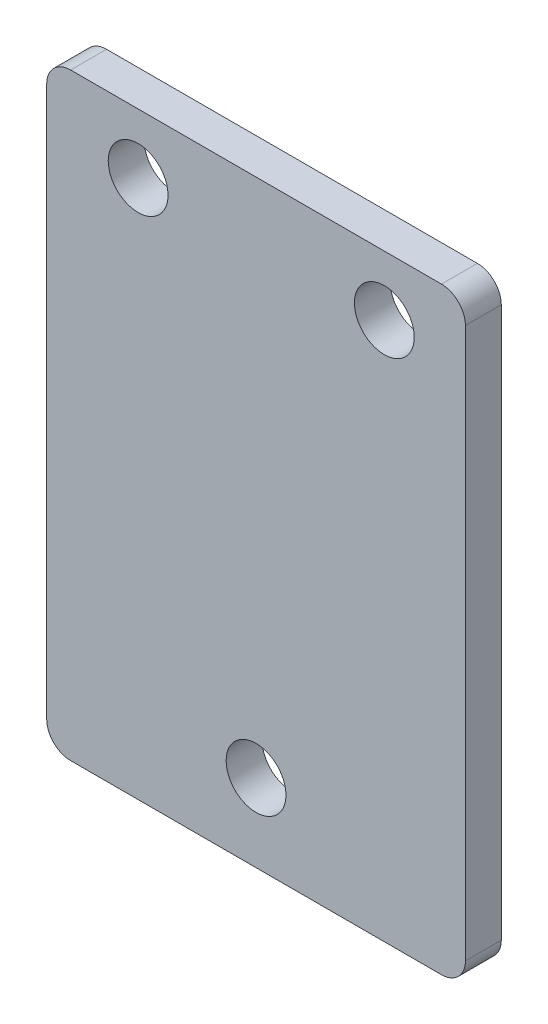
ISO-10303-21;
HEADER;
FILE_DESCRIPTION(('STEP AP214'),'2;1');
FILE_NAME('part.step','',(''),(''),'','','');
FILE_SCHEMA(('AUTOMOTIVE_DESIGN { 1 0 10303 214 1 1 1 1 }'));
ENDSEC;
DATA;
#1=APPLICATION_CONTEXT('core data for automotive mechanical design processes');
#2=APPLICATION_PROTOCOL_DEFINITION('international standard','automotive_design',2000,#1);
#3=PRODUCT_CONTEXT('',#1,'mechanical');
#4=PRODUCT('Part','Part','',(#3));
#5=PRODUCT_RELATED_PRODUCT_CATEGORY('part','',(#4));
#6=PRODUCT_DEFINITION_FORMATION('','',#4);
#7=PRODUCT_DEFINITION_CONTEXT('part definition',#1,'design');
#8=PRODUCT_DEFINITION('design','',#6,#7);
#9=PRODUCT_DEFINITION_SHAPE('','',#8);
#10=(LENGTH_UNIT() NAMED_UNIT(*) SI_UNIT(.MILLI.,.METRE.));
#11=(NAMED_UNIT(*) PLANE_ANGLE_UNIT() SI_UNIT($,.RADIAN.));
#12=(NAMED_UNIT(*) SI_UNIT($,.STERADIAN.) SOLID_ANGLE_UNIT());
#13=UNCERTAINTY_MEASURE_WITH_UNIT(LENGTH_MEASURE(1.E-05),#10,'distance_accuracy_value','');
#14=(GEOMETRIC_REPRESENTATION_CONTEXT(3) GLOBAL_UNCERTAINTY_ASSIGNED_CONTEXT((#13)) GLOBAL_UNIT_ASSIGNED_CONTEXT((#10,
#11,#12)) REPRESENTATION_CONTEXT('',''));
#15=CARTESIAN_POINT('',(0.,0.,0.));
#16=DIRECTION('',(0.,0.,1.));
#17=DIRECTION('',(1.,0.,0.));
#18=AXIS2_PLACEMENT_3D('',#15,#16,#17);
#19=CARTESIAN_POINT('',(15.5,-33.,-3.));
#20=DIRECTION('',(0.,0.,-1.));
#21=DIRECTION('',(-1.,0.,0.));
#22=AXIS2_PLACEMENT_3D('',#19,#20,#21);
#23=PLANE('',#22);
#24=CARTESIAN_POINT('',(-9.85884103233329,10.,-3.));
#25=DIRECTION('',(0.,0.,-1.));
#26=DIRECTION('',(-1.,0.,0.));
#27=AXIS2_PLACEMENT_3D('',#24,#25,#26);
#28=CIRCLE('',#27,2.5);
#29=CARTESIAN_POINT('',(-12.3588410323333,10.,-3.));
#30=VERTEX_POINT('',#29);
#31=EDGE_CURVE('E182',#30,#30,#28,.T.);
#32=ORIENTED_EDGE('',*,*,#31,.F.);
#33=EDGE_LOOP('',(#32));
#34=FACE_BOUND('',#33,.T.);
#35=CARTESIAN_POINT('',(15.5,-33.,-3.));
#36=DIRECTION('',(0.,0.,-1.));
#37=DIRECTION('',(-1.,0.,0.));
#38=AXIS2_PLACEMENT_3D('',#35,#36,#37);
#39=CIRCLE('',#38,2.);
#40=CARTESIAN_POINT('',(17.5,-33.,-3.));
#41=VERTEX_POINT('',#40);
#42=CARTESIAN_POINT('',(15.5,-35.,-3.));
#43=VERTEX_POINT('',#42);
#44=EDGE_CURVE('E145',#41,#43,#39,.T.);
#45=ORIENTED_EDGE('',*,*,#44,.T.);
#46=DIRECTION('',(-1.,0.,0.));
#47=VECTOR('',#46,1.);
#48=CARTESIAN_POINT('',(-15.5,-35.,-3.));
#49=LINE('',#48,#47);
#50=CARTESIAN_POINT('',(-15.5,-35.,-3.));
#51=VERTEX_POINT('',#50);
#52=EDGE_CURVE('E93',#43,#51,#49,.T.);
#53=ORIENTED_EDGE('',*,*,#52,.T.);
#54=CARTESIAN_POINT('',(-15.5,-33.,-3.));
#55=DIRECTION('',(0.,0.,-1.));
#56=DIRECTION('',(1.,0.,0.));
#57=AXIS2_PLACEMENT_3D('',#54,#55,#56);
#58=CIRCLE('',#57,2.);
#59=CARTESIAN_POINT('',(-17.5,-33.,-3.));
#60=VERTEX_POINT('',#59);
#61=EDGE_CURVE('E160',#51,#60,#58,.T.);
#62=ORIENTED_EDGE('',*,*,#61,.T.);
#63=DIRECTION('',(0.,1.,0.));
#64=VECTOR('',#63,1.);
#65=CARTESIAN_POINT('',(-17.5,-33.,-3.));
#66=LINE('',#65,#64);
#67=CARTESIAN_POINT('',(-17.5,13.,-3.));
#68=VERTEX_POINT('',#67);
#69=EDGE_CURVE('E173',#60,#68,#66,.T.);
#70=ORIENTED_EDGE('',*,*,#69,.T.);
#71=CARTESIAN_POINT('',(-15.5,13.,-3.));
#72=DIRECTION('',(0.,0.,-1.));
#73=DIRECTION('',(1.,0.,0.));
#74=AXIS2_PLACEMENT_3D('',#71,#72,#73);
#75=CIRCLE('',#74,2.);
#76=CARTESIAN_POINT('',(-15.5,15.,-3.));
#77=VERTEX_POINT('',#76);
#78=EDGE_CURVE('E112',#68,#77,#75,.T.);
#79=ORIENTED_EDGE('',*,*,#78,.T.);
#80=DIRECTION('',(1.,0.,0.));
#81=VECTOR('',#80,1.);
#82=CARTESIAN_POINT('',(-15.5,15.,-3.));
#83=LINE('',#82,#81);
#84=CARTESIAN_POINT('',(15.5,15.,-3.));
#85=VERTEX_POINT('',#84);
#86=EDGE_CURVE('E106',#77,#85,#83,.T.);
#87=ORIENTED_EDGE('',*,*,#86,.T.);
#88=CARTESIAN_POINT('',(15.5,13.,-3.));
#89=DIRECTION('',(0.,0.,-1.));
#90=DIRECTION('',(-1.,0.,0.));
#91=AXIS2_PLACEMENT_3D('',#88,#89,#90);
#92=CIRCLE('',#91,2.);
#93=CARTESIAN_POINT('',(17.5,13.,-3.));
#94=VERTEX_POINT('',#93);
#95=EDGE_CURVE('E110',#85,#94,#92,.T.);
#96=ORIENTED_EDGE('',*,*,#95,.T.);
#97=DIRECTION('',(0.,-1.,0.));
#98=VECTOR('',#97,1.);
#99=CARTESIAN_POINT('',(17.5,-33.,-3.));
#100=LINE('',#99,#98);
#101=EDGE_CURVE('E50',#94,#41,#100,.T.);
#102=ORIENTED_EDGE('',*,*,#101,.T.);
#103=EDGE_LOOP('',(#45,#53,#62,#70,#79,#87,#96,#102));
#104=FACE_BOUND('',#103,.T.);
#105=CARTESIAN_POINT('',(0.,-28.5,-3.));
#106=DIRECTION('',(0.,0.,-1.));
#107=DIRECTION('',(-1.,0.,0.));
#108=AXIS2_PLACEMENT_3D('',#105,#106,#107);
#109=CIRCLE('',#108,2.5);
#110=CARTESIAN_POINT('',(-2.5,-28.5,-3.));
#111=VERTEX_POINT('',#110);
#112=EDGE_CURVE('E134',#111,#111,#109,.T.);
#113=ORIENTED_EDGE('',*,*,#112,.F.);
#114=EDGE_LOOP('',(#113));
#115=FACE_BOUND('',#114,.T.);
#116=CARTESIAN_POINT('',(10.7207553969765,10.,-3.));
#117=DIRECTION('',(0.,0.,-1.));
#118=DIRECTION('',(-1.,0.,0.));
#119=AXIS2_PLACEMENT_3D('',#116,#117,#118);
#120=CIRCLE('',#119,2.5);
#121=CARTESIAN_POINT('',(8.22075539697653,10.,-3.));
#122=VERTEX_POINT('',#121);
#123=EDGE_CURVE('E188',#122,#122,#120,.T.);
#124=ORIENTED_EDGE('',*,*,#123,.F.);
#125=EDGE_LOOP('',(#124));
#126=FACE_BOUND('',#125,.T.);
#127=ADVANCED_FACE('F33',(#34,#104,#115,#126),#23,.T.);
#128=CARTESIAN_POINT('',(15.5,-33.,0.));
#129=DIRECTION('',(0.,0.,-1.));
#130=DIRECTION('',(-1.,0.,0.));
#131=AXIS2_PLACEMENT_3D('',#128,#129,#130);
#132=PLANE('',#131);
#133=CARTESIAN_POINT('',(15.5,-33.,0.));
#134=DIRECTION('',(0.,0.,-1.));
#135=DIRECTION('',(-1.,0.,0.));
#136=AXIS2_PLACEMENT_3D('',#133,#134,#135);
#137=CIRCLE('',#136,2.);
#138=CARTESIAN_POINT('',(17.5,-33.,0.));
#139=VERTEX_POINT('',#138);
#140=CARTESIAN_POINT('',(15.5,-35.,0.));
#141=VERTEX_POINT('',#140);
#142=EDGE_CURVE('E130',#139,#141,#137,.T.);
#143=ORIENTED_EDGE('',*,*,#142,.F.);
#144=DIRECTION('',(0.,-1.,0.));
#145=VECTOR('',#144,1.);
#146=CARTESIAN_POINT('',(17.5,-33.,0.));
#147=LINE('',#146,#145);
#148=CARTESIAN_POINT('',(17.5,13.,0.));
#149=VERTEX_POINT('',#148);
#150=EDGE_CURVE('E85',#149,#139,#147,.T.);
#151=ORIENTED_EDGE('',*,*,#150,.F.);
#152=CARTESIAN_POINT('',(15.5,13.,0.));
#153=DIRECTION('',(0.,0.,-1.));
#154=DIRECTION('',(-1.,0.,0.));
#155=AXIS2_PLACEMENT_3D('',#152,#153,#154);
#156=CIRCLE('',#155,2.);
#157=CARTESIAN_POINT('',(15.5,15.,0.));
#158=VERTEX_POINT('',#157);
#159=EDGE_CURVE('E79',#158,#149,#156,.T.);
#160=ORIENTED_EDGE('',*,*,#159,.F.);
#161=DIRECTION('',(1.,0.,0.));
#162=VECTOR('',#161,1.);
#163=CARTESIAN_POINT('',(-15.5,15.,0.));
#164=LINE('',#163,#162);
#165=CARTESIAN_POINT('',(-15.5,15.,0.));
#166=VERTEX_POINT('',#165);
#167=EDGE_CURVE('E120',#166,#158,#164,.T.);
#168=ORIENTED_EDGE('',*,*,#167,.F.);
#169=CARTESIAN_POINT('',(-15.5,13.,0.));
#170=DIRECTION('',(0.,0.,-1.));
#171=DIRECTION('',(1.,0.,0.));
#172=AXIS2_PLACEMENT_3D('',#169,#170,#171);
#173=CIRCLE('',#172,2.);
#174=CARTESIAN_POINT('',(-17.5,13.,0.));
#175=VERTEX_POINT('',#174);
#176=EDGE_CURVE('E140',#175,#166,#173,.T.);
#177=ORIENTED_EDGE('',*,*,#176,.F.);
#178=DIRECTION('',(0.,1.,0.));
#179=VECTOR('',#178,1.);
#180=CARTESIAN_POINT('',(-17.5,-33.,0.));
#181=LINE('',#180,#179);
#182=CARTESIAN_POINT('',(-17.5,-33.,0.));
#183=VERTEX_POINT('',#182);
#184=EDGE_CURVE('E138',#183,#175,#181,.T.);
#185=ORIENTED_EDGE('',*,*,#184,.F.);
#186=CARTESIAN_POINT('',(-15.5,-33.,0.));
#187=DIRECTION('',(0.,0.,-1.));
#188=DIRECTION('',(1.,0.,0.));
#189=AXIS2_PLACEMENT_3D('',#186,#187,#188);
#190=CIRCLE('',#189,2.);
#191=CARTESIAN_POINT('',(-15.5,-35.,0.));
#192=VERTEX_POINT('',#191);
#193=EDGE_CURVE('E136',#192,#183,#190,.T.);
#194=ORIENTED_EDGE('',*,*,#193,.F.);
#195=DIRECTION('',(-1.,0.,0.));
#196=VECTOR('',#195,1.);
#197=CARTESIAN_POINT('',(-15.5,-35.,0.));
#198=LINE('',#197,#196);
#199=EDGE_CURVE('E133',#141,#192,#198,.T.);
#200=ORIENTED_EDGE('',*,*,#199,.F.);
#201=EDGE_LOOP('',(#143,#151,#160,#168,#177,#185,#194,#200));
#202=FACE_BOUND('',#201,.T.);
#203=CARTESIAN_POINT('',(0.,-28.5,0.));
#204=DIRECTION('',(0.,0.,-1.));
#205=DIRECTION('',(-1.,0.,0.));
#206=AXIS2_PLACEMENT_3D('',#203,#204,#205);
#207=CIRCLE('',#206,2.5);
#208=CARTESIAN_POINT('',(-2.5,-28.5,0.));
#209=VERTEX_POINT('',#208);
#210=EDGE_CURVE('E179',#209,#209,#207,.T.);
#211=ORIENTED_EDGE('',*,*,#210,.T.);
#212=EDGE_LOOP('',(#211));
#213=FACE_BOUND('',#212,.T.);
#214=CARTESIAN_POINT('',(-9.85884103233329,10.,0.));
#215=DIRECTION('',(0.,0.,-1.));
#216=DIRECTION('',(-1.,0.,0.));
#217=AXIS2_PLACEMENT_3D('',#214,#215,#216);
#218=CIRCLE('',#217,2.5);
#219=CARTESIAN_POINT('',(-12.3588410323333,10.,0.));
#220=VERTEX_POINT('',#219);
#221=EDGE_CURVE('E185',#220,#220,#218,.T.);
#222=ORIENTED_EDGE('',*,*,#221,.T.);
#223=EDGE_LOOP('',(#222));
#224=FACE_BOUND('',#223,.T.);
#225=CARTESIAN_POINT('',(10.7207553969765,10.,0.));
#226=DIRECTION('',(0.,0.,-1.));
#227=DIRECTION('',(-1.,0.,0.));
#228=AXIS2_PLACEMENT_3D('',#225,#226,#227);
#229=CIRCLE('',#228,2.5);
#230=CARTESIAN_POINT('',(8.22075539697653,10.,0.));
#231=VERTEX_POINT('',#230);
#232=EDGE_CURVE('E191',#231,#231,#229,.T.);
#233=ORIENTED_EDGE('',*,*,#232,.T.);
#234=EDGE_LOOP('',(#233));
#235=FACE_BOUND('',#234,.T.);
#236=ADVANCED_FACE('F164',(#202,#213,#224,#235),#132,.F.);
#237=CARTESIAN_POINT('',(15.5,-33.,-3.));
#238=DIRECTION('',(0.,0.,1.));
#239=DIRECTION('',(1.,0.,0.));
#240=AXIS2_PLACEMENT_3D('',#237,#238,#239);
#241=CYLINDRICAL_SURFACE('',#240,2.);
#242=ORIENTED_EDGE('',*,*,#142,.T.);
#243=DIRECTION('',(0.,0.,1.));
#244=VECTOR('',#243,1.);
#245=CARTESIAN_POINT('',(15.5,-35.,-3.));
#246=LINE('',#245,#244);
#247=EDGE_CURVE('E11',#43,#141,#246,.T.);
#248=ORIENTED_EDGE('',*,*,#247,.F.);
#249=ORIENTED_EDGE('',*,*,#44,.F.);
#250=DIRECTION('',(0.,0.,1.));
#251=VECTOR('',#250,1.);
#252=CARTESIAN_POINT('',(17.5,-33.,-3.));
#253=LINE('',#252,#251);
#254=EDGE_CURVE('E126',#41,#139,#253,.T.);
#255=ORIENTED_EDGE('',*,*,#254,.T.);
#256=EDGE_LOOP('',(#242,#248,#249,#255));
#257=FACE_BOUND('',#256,.T.);
#258=ADVANCED_FACE('F35',(#257),#241,.T.);
#259=CARTESIAN_POINT('',(-15.5,-35.,-3.));
#260=DIRECTION('',(0.,1.,0.));
#261=DIRECTION('',(-1.,0.,0.));
#262=AXIS2_PLACEMENT_3D('',#259,#260,#261);
#263=PLANE('',#262);
#264=ORIENTED_EDGE('',*,*,#199,.T.);
#265=DIRECTION('',(0.,0.,1.));
#266=VECTOR('',#265,1.);
#267=CARTESIAN_POINT('',(-15.5,-35.,-3.));
#268=LINE('',#267,#266);
#269=EDGE_CURVE('E42',#51,#192,#268,.T.);
#270=ORIENTED_EDGE('',*,*,#269,.F.);
#271=ORIENTED_EDGE('',*,*,#52,.F.);
#272=ORIENTED_EDGE('',*,*,#247,.T.);
#273=EDGE_LOOP('',(#264,#270,#271,#272));
#274=FACE_BOUND('',#273,.T.);
#275=ADVANCED_FACE('F224',(#274),#263,.F.);
#276=CARTESIAN_POINT('',(-15.5,-33.,-3.));
#277=DIRECTION('',(0.,0.,1.));
#278=DIRECTION('',(1.,0.,0.));
#279=AXIS2_PLACEMENT_3D('',#276,#277,#278);
#280=CYLINDRICAL_SURFACE('',#279,2.);
#281=ORIENTED_EDGE('',*,*,#193,.T.);
#282=DIRECTION('',(0.,0.,1.));
#283=VECTOR('',#282,1.);
#284=CARTESIAN_POINT('',(-17.5,-33.,-3.));
#285=LINE('',#284,#283);
#286=EDGE_CURVE('E152',#60,#183,#285,.T.);
#287=ORIENTED_EDGE('',*,*,#286,.F.);
#288=ORIENTED_EDGE('',*,*,#61,.F.);
#289=ORIENTED_EDGE('',*,*,#269,.T.);
#290=EDGE_LOOP('',(#281,#287,#288,#289));
#291=FACE_BOUND('',#290,.T.);
#292=ADVANCED_FACE('F158',(#291),#280,.T.);
#293=CARTESIAN_POINT('',(-17.5,-33.,-3.));
#294=DIRECTION('',(1.,0.,0.));
#295=DIRECTION('',(0.,1.,0.));
#296=AXIS2_PLACEMENT_3D('',#293,#294,#295);
#297=PLANE('',#296);
#298=ORIENTED_EDGE('',*,*,#184,.T.);
#299=DIRECTION('',(0.,0.,1.));
#300=VECTOR('',#299,1.);
#301=CARTESIAN_POINT('',(-17.5,13.,-3.));
#302=LINE('',#301,#300);
#303=EDGE_CURVE('E149',#68,#175,#302,.T.);
#304=ORIENTED_EDGE('',*,*,#303,.F.);
#305=ORIENTED_EDGE('',*,*,#69,.F.);
#306=ORIENTED_EDGE('',*,*,#286,.T.);
#307=EDGE_LOOP('',(#298,#304,#305,#306));
#308=FACE_BOUND('',#307,.T.);
#309=ADVANCED_FACE('F169',(#308),#297,.F.);
#310=CARTESIAN_POINT('',(-15.5,13.,-3.));
#311=DIRECTION('',(0.,0.,1.));
#312=DIRECTION('',(1.,0.,0.));
#313=AXIS2_PLACEMENT_3D('',#310,#311,#312);
#314=CYLINDRICAL_SURFACE('',#313,2.);
#315=ORIENTED_EDGE('',*,*,#176,.T.);
#316=DIRECTION('',(0.,0.,1.));
#317=VECTOR('',#316,1.);
#318=CARTESIAN_POINT('',(-15.5,15.,-3.));
#319=LINE('',#318,#317);
#320=EDGE_CURVE('E121',#77,#166,#319,.T.);
#321=ORIENTED_EDGE('',*,*,#320,.F.);
#322=ORIENTED_EDGE('',*,*,#78,.F.);
#323=ORIENTED_EDGE('',*,*,#303,.T.);
#324=EDGE_LOOP('',(#315,#321,#322,#323));
#325=FACE_BOUND('',#324,.T.);
#326=ADVANCED_FACE('F172',(#325),#314,.T.);
#327=CARTESIAN_POINT('',(-15.5,15.,-3.));
#328=DIRECTION('',(0.,-1.,0.));
#329=DIRECTION('',(0.,0.,-1.));
#330=AXIS2_PLACEMENT_3D('',#327,#328,#329);
#331=PLANE('',#330);
#332=ORIENTED_EDGE('',*,*,#167,.T.);
#333=DIRECTION('',(0.,0.,1.));
#334=VECTOR('',#333,1.);
#335=CARTESIAN_POINT('',(15.5,15.,-3.));
#336=LINE('',#335,#334);
#337=EDGE_CURVE('E117',#85,#158,#336,.T.);
#338=ORIENTED_EDGE('',*,*,#337,.F.);
#339=ORIENTED_EDGE('',*,*,#86,.F.);
#340=ORIENTED_EDGE('',*,*,#320,.T.);
#341=EDGE_LOOP('',(#332,#338,#339,#340));
#342=FACE_BOUND('',#341,.T.);
#343=ADVANCED_FACE('F118',(#342),#331,.F.);
#344=CARTESIAN_POINT('',(15.5,13.,-3.));
#345=DIRECTION('',(0.,0.,1.));
#346=DIRECTION('',(1.,0.,0.));
#347=AXIS2_PLACEMENT_3D('',#344,#345,#346);
#348=CYLINDRICAL_SURFACE('',#347,2.);
#349=ORIENTED_EDGE('',*,*,#159,.T.);
#350=DIRECTION('',(0.,0.,1.));
#351=VECTOR('',#350,1.);
#352=CARTESIAN_POINT('',(17.5,13.,-3.));
#353=LINE('',#352,#351);
#354=EDGE_CURVE('E122',#94,#149,#353,.T.);
#355=ORIENTED_EDGE('',*,*,#354,.F.);
#356=ORIENTED_EDGE('',*,*,#95,.F.);
#357=ORIENTED_EDGE('',*,*,#337,.T.);
#358=EDGE_LOOP('',(#349,#355,#356,#357));
#359=FACE_BOUND('',#358,.T.);
#360=ADVANCED_FACE('F124',(#359),#348,.T.);
#361=CARTESIAN_POINT('',(17.5,-33.,-3.));
#362=DIRECTION('',(-1.,0.,0.));
#363=DIRECTION('',(0.,-1.,0.));
#364=AXIS2_PLACEMENT_3D('',#361,#362,#363);
#365=PLANE('',#364);
#366=ORIENTED_EDGE('',*,*,#150,.T.);
#367=ORIENTED_EDGE('',*,*,#254,.F.);
#368=ORIENTED_EDGE('',*,*,#101,.F.);
#369=ORIENTED_EDGE('',*,*,#354,.T.);
#370=EDGE_LOOP('',(#366,#367,#368,#369));
#371=FACE_BOUND('',#370,.T.);
#372=ADVANCED_FACE('F212',(#371),#365,.F.);
#373=CARTESIAN_POINT('',(0.,-28.5,-3.));
#374=DIRECTION('',(0.,0.,1.));
#375=DIRECTION('',(1.,0.,0.));
#376=AXIS2_PLACEMENT_3D('',#373,#374,#375);
#377=CYLINDRICAL_SURFACE('',#376,2.5);
#378=ORIENTED_EDGE('',*,*,#112,.T.);
#379=EDGE_LOOP('',(#378));
#380=FACE_BOUND('',#379,.T.);
#381=ORIENTED_EDGE('',*,*,#210,.F.);
#382=EDGE_LOOP('',(#381));
#383=FACE_BOUND('',#382,.T.);
#384=ADVANCED_FACE('F209',(#380,#383),#377,.F.);
#385=CARTESIAN_POINT('',(-9.85884103233329,10.,-3.));
#386=DIRECTION('',(0.,0.,1.));
#387=DIRECTION('',(1.,0.,0.));
#388=AXIS2_PLACEMENT_3D('',#385,#386,#387);
#389=CYLINDRICAL_SURFACE('',#388,2.5);
#390=ORIENTED_EDGE('',*,*,#31,.T.);
#391=EDGE_LOOP('',(#390));
#392=FACE_BOUND('',#391,.T.);
#393=ORIENTED_EDGE('',*,*,#221,.F.);
#394=EDGE_LOOP('',(#393));
#395=FACE_BOUND('',#394,.T.);
#396=ADVANCED_FACE('F288',(#392,#395),#389,.F.);
#397=CARTESIAN_POINT('',(10.7207553969765,10.,-3.));
#398=DIRECTION('',(0.,0.,1.));
#399=DIRECTION('',(1.,0.,0.));
#400=AXIS2_PLACEMENT_3D('',#397,#398,#399);
#401=CYLINDRICAL_SURFACE('',#400,2.5);
#402=ORIENTED_EDGE('',*,*,#123,.T.);
#403=EDGE_LOOP('',(#402));
#404=FACE_BOUND('',#403,.T.);
#405=ORIENTED_EDGE('',*,*,#232,.F.);
#406=EDGE_LOOP('',(#405));
#407=FACE_BOUND('',#406,.T.);
#408=ADVANCED_FACE('F197',(#404,#407),#401,.F.);
#409=CLOSED_SHELL('',(#127,#236,#258,#275,#292,#309,#326,#343,#360,#372,#384,#396,#408));
#410=MANIFOLD_SOLID_BREP('B2',#409);
#411=ADVANCED_BREP_SHAPE_REPRESENTATION('',(#18,#410),#14);
#412=SHAPE_DEFINITION_REPRESENTATION(#9,#411);
ENDSEC;
END-ISO-10303-21;
